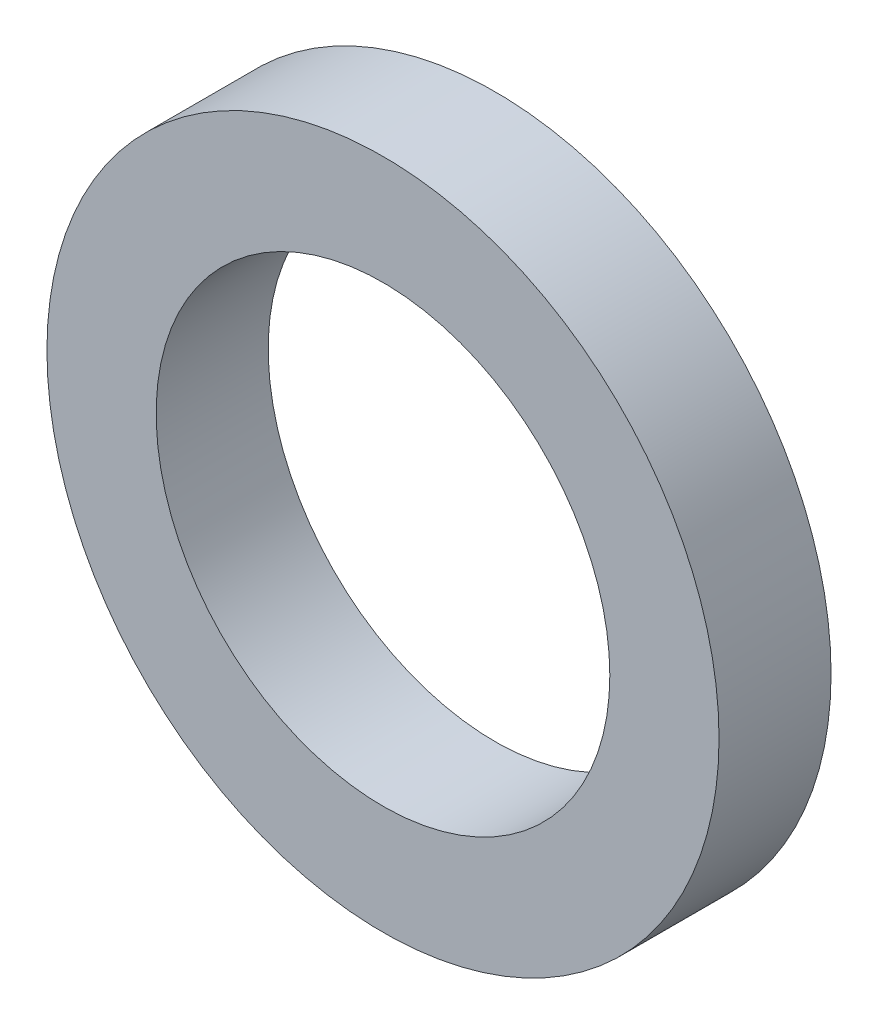
ISO-10303-21;
HEADER;
FILE_DESCRIPTION(('STEP AP214'),'2;1');
FILE_NAME('part.step','',(''),(''),'','','');
FILE_SCHEMA(('AUTOMOTIVE_DESIGN { 1 0 10303 214 1 1 1 1 }'));
ENDSEC;
DATA;
#1=APPLICATION_CONTEXT('core data for automotive mechanical design processes');
#2=APPLICATION_PROTOCOL_DEFINITION('international standard','automotive_design',2000,#1);
#3=PRODUCT_CONTEXT('',#1,'mechanical');
#4=PRODUCT('Part','Part','',(#3));
#5=PRODUCT_RELATED_PRODUCT_CATEGORY('part','',(#4));
#6=PRODUCT_DEFINITION_FORMATION('','',#4);
#7=PRODUCT_DEFINITION_CONTEXT('part definition',#1,'design');
#8=PRODUCT_DEFINITION('design','',#6,#7);
#9=PRODUCT_DEFINITION_SHAPE('','',#8);
#10=(LENGTH_UNIT() NAMED_UNIT(*) SI_UNIT(.MILLI.,.METRE.));
#11=(NAMED_UNIT(*) PLANE_ANGLE_UNIT() SI_UNIT($,.RADIAN.));
#12=(NAMED_UNIT(*) SI_UNIT($,.STERADIAN.) SOLID_ANGLE_UNIT());
#13=UNCERTAINTY_MEASURE_WITH_UNIT(LENGTH_MEASURE(1.E-05),#10,'distance_accuracy_value','');
#14=(GEOMETRIC_REPRESENTATION_CONTEXT(3) GLOBAL_UNCERTAINTY_ASSIGNED_CONTEXT((#13)) GLOBAL_UNIT_ASSIGNED_CONTEXT((#10,
#11,#12)) REPRESENTATION_CONTEXT('',''));
#15=CARTESIAN_POINT('',(0.,0.,0.));
#16=DIRECTION('',(0.,0.,1.));
#17=DIRECTION('',(1.,0.,0.));
#18=AXIS2_PLACEMENT_3D('',#15,#16,#17);
#19=CARTESIAN_POINT('',(0.,0.,2.));
#20=DIRECTION('',(0.,0.,1.));
#21=DIRECTION('',(1.,0.,0.));
#22=AXIS2_PLACEMENT_3D('',#19,#20,#21);
#23=PLANE('',#22);
#24=CARTESIAN_POINT('',(0.,0.,2.));
#25=DIRECTION('',(0.,0.,1.));
#26=DIRECTION('',(1.,0.,0.));
#27=AXIS2_PLACEMENT_3D('',#24,#25,#26);
#28=CIRCLE('',#27,6.);
#29=CARTESIAN_POINT('',(6.,0.,2.));
#30=VERTEX_POINT('',#29);
#31=EDGE_CURVE('E10',#30,#30,#28,.T.);
#32=ORIENTED_EDGE('',*,*,#31,.T.);
#33=EDGE_LOOP('',(#32));
#34=FACE_BOUND('',#33,.T.);
#35=CARTESIAN_POINT('',(0.,0.,2.));
#36=DIRECTION('',(0.,0.,1.));
#37=DIRECTION('',(1.,0.,0.));
#38=AXIS2_PLACEMENT_3D('',#35,#36,#37);
#39=CIRCLE('',#38,4.05);
#40=CARTESIAN_POINT('',(4.05,0.,2.));
#41=VERTEX_POINT('',#40);
#42=EDGE_CURVE('E52',#41,#41,#39,.T.);
#43=ORIENTED_EDGE('',*,*,#42,.F.);
#44=EDGE_LOOP('',(#43));
#45=FACE_BOUND('',#44,.T.);
#46=ADVANCED_FACE('F41',(#34,#45),#23,.T.);
#47=CARTESIAN_POINT('',(0.,0.,0.));
#48=DIRECTION('',(0.,0.,1.));
#49=DIRECTION('',(1.,0.,0.));
#50=AXIS2_PLACEMENT_3D('',#47,#48,#49);
#51=PLANE('',#50);
#52=CARTESIAN_POINT('',(0.,0.,0.));
#53=DIRECTION('',(0.,0.,1.));
#54=DIRECTION('',(1.,0.,0.));
#55=AXIS2_PLACEMENT_3D('',#52,#53,#54);
#56=CIRCLE('',#55,6.);
#57=CARTESIAN_POINT('',(6.,0.,0.));
#58=VERTEX_POINT('',#57);
#59=EDGE_CURVE('E45',#58,#58,#56,.T.);
#60=ORIENTED_EDGE('',*,*,#59,.F.);
#61=EDGE_LOOP('',(#60));
#62=FACE_BOUND('',#61,.T.);
#63=CARTESIAN_POINT('',(0.,0.,0.));
#64=DIRECTION('',(0.,0.,1.));
#65=DIRECTION('',(1.,0.,0.));
#66=AXIS2_PLACEMENT_3D('',#63,#64,#65);
#67=CIRCLE('',#66,4.05);
#68=CARTESIAN_POINT('',(4.05,0.,0.));
#69=VERTEX_POINT('',#68);
#70=EDGE_CURVE('E54',#69,#69,#67,.T.);
#71=ORIENTED_EDGE('',*,*,#70,.T.);
#72=EDGE_LOOP('',(#71));
#73=FACE_BOUND('',#72,.T.);
#74=ADVANCED_FACE('F64',(#62,#73),#51,.F.);
#75=CARTESIAN_POINT('',(0.,0.,2.));
#76=DIRECTION('',(0.,0.,-1.));
#77=DIRECTION('',(-1.,0.,0.));
#78=AXIS2_PLACEMENT_3D('',#75,#76,#77);
#79=CYLINDRICAL_SURFACE('',#78,6.);
#80=ORIENTED_EDGE('',*,*,#31,.F.);
#81=EDGE_LOOP('',(#80));
#82=FACE_BOUND('',#81,.T.);
#83=ORIENTED_EDGE('',*,*,#59,.T.);
#84=EDGE_LOOP('',(#83));
#85=FACE_BOUND('',#84,.T.);
#86=ADVANCED_FACE('F43',(#82,#85),#79,.T.);
#87=CARTESIAN_POINT('',(0.,0.,2.));
#88=DIRECTION('',(0.,0.,-1.));
#89=DIRECTION('',(-1.,0.,0.));
#90=AXIS2_PLACEMENT_3D('',#87,#88,#89);
#91=CYLINDRICAL_SURFACE('',#90,4.05);
#92=ORIENTED_EDGE('',*,*,#42,.T.);
#93=EDGE_LOOP('',(#92));
#94=FACE_BOUND('',#93,.T.);
#95=ORIENTED_EDGE('',*,*,#70,.F.);
#96=EDGE_LOOP('',(#95));
#97=FACE_BOUND('',#96,.T.);
#98=ADVANCED_FACE('F60',(#94,#97),#91,.F.);
#99=CLOSED_SHELL('',(#46,#74,#86,#98));
#100=MANIFOLD_SOLID_BREP('B2',#99);
#101=ADVANCED_BREP_SHAPE_REPRESENTATION('',(#18,#100),#14);
#102=SHAPE_DEFINITION_REPRESENTATION(#9,#101);
ENDSEC;
END-ISO-10303-21;
